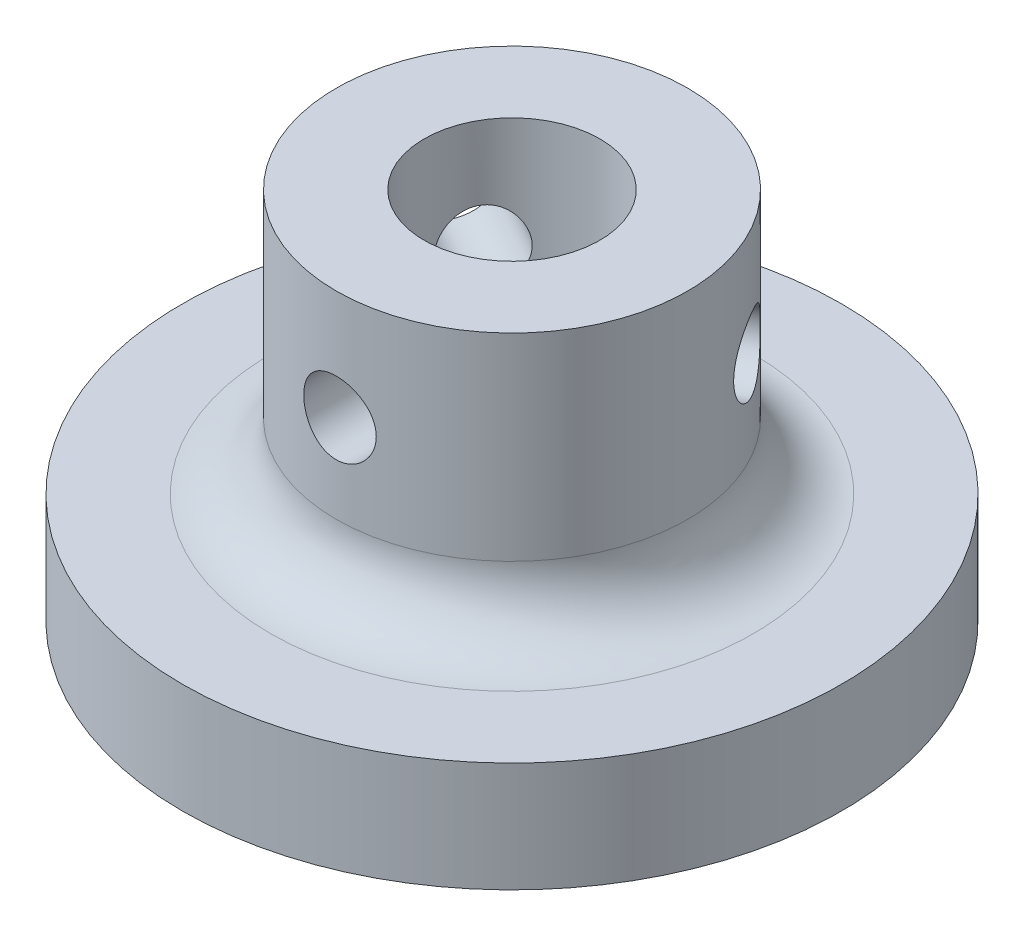
ISO-10303-21;
HEADER;
FILE_DESCRIPTION(('STEP AP214'),'2;1');
FILE_NAME('part.step','',(''),(''),'','','');
FILE_SCHEMA(('AUTOMOTIVE_DESIGN { 1 0 10303 214 1 1 1 1 }'));
ENDSEC;
DATA;
#1=APPLICATION_CONTEXT('core data for automotive mechanical design processes');
#2=APPLICATION_PROTOCOL_DEFINITION('international standard','automotive_design',2000,#1);
#3=PRODUCT_CONTEXT('',#1,'mechanical');
#4=PRODUCT('Part','Part','',(#3));
#5=PRODUCT_RELATED_PRODUCT_CATEGORY('part','',(#4));
#6=PRODUCT_DEFINITION_FORMATION('','',#4);
#7=PRODUCT_DEFINITION_CONTEXT('part definition',#1,'design');
#8=PRODUCT_DEFINITION('design','',#6,#7);
#9=PRODUCT_DEFINITION_SHAPE('','',#8);
#10=(LENGTH_UNIT() NAMED_UNIT(*) SI_UNIT(.MILLI.,.METRE.));
#11=(NAMED_UNIT(*) PLANE_ANGLE_UNIT() SI_UNIT($,.RADIAN.));
#12=(NAMED_UNIT(*) SI_UNIT($,.STERADIAN.) SOLID_ANGLE_UNIT());
#13=UNCERTAINTY_MEASURE_WITH_UNIT(LENGTH_MEASURE(1.E-05),#10,'distance_accuracy_value','');
#14=(GEOMETRIC_REPRESENTATION_CONTEXT(3) GLOBAL_UNCERTAINTY_ASSIGNED_CONTEXT((#13)) GLOBAL_UNIT_ASSIGNED_CONTEXT((#10,
#11,#12)) REPRESENTATION_CONTEXT('',''));
#15=CARTESIAN_POINT('',(0.,0.,0.));
#16=DIRECTION('',(0.,0.,1.));
#17=DIRECTION('',(1.,0.,0.));
#18=AXIS2_PLACEMENT_3D('',#15,#16,#17);
#19=CARTESIAN_POINT('',(0.,0.,0.));
#20=DIRECTION('',(0.,-1.,0.));
#21=DIRECTION('',(0.,0.,-1.));
#22=AXIS2_PLACEMENT_3D('',#19,#20,#21);
#23=PLANE('',#22);
#24=CARTESIAN_POINT('',(0.,0.,0.));
#25=DIRECTION('',(0.,-1.,0.));
#26=DIRECTION('',(0.,0.,-1.));
#27=AXIS2_PLACEMENT_3D('',#24,#25,#26);
#28=CIRCLE('',#27,15.);
#29=CARTESIAN_POINT('',(0.,0.,-15.));
#30=VERTEX_POINT('',#29);
#31=EDGE_CURVE('E44',#30,#30,#28,.T.);
#32=ORIENTED_EDGE('',*,*,#31,.T.);
#33=EDGE_LOOP('',(#32));
#34=FACE_BOUND('',#33,.T.);
#35=ADVANCED_FACE('F33',(#34),#23,.T.);
#36=CARTESIAN_POINT('',(0.,0.,0.));
#37=DIRECTION('',(0.,-1.,0.));
#38=DIRECTION('',(0.,0.,-1.));
#39=AXIS2_PLACEMENT_3D('',#36,#37,#38);
#40=CYLINDRICAL_SURFACE('',#39,15.);
#41=CARTESIAN_POINT('',(0.,5.,0.));
#42=DIRECTION('',(0.,-1.,0.));
#43=DIRECTION('',(0.,0.,-1.));
#44=AXIS2_PLACEMENT_3D('',#41,#42,#43);
#45=CIRCLE('',#44,15.);
#46=CARTESIAN_POINT('',(0.,5.,-15.));
#47=VERTEX_POINT('',#46);
#48=EDGE_CURVE('E48',#47,#47,#45,.T.);
#49=ORIENTED_EDGE('',*,*,#48,.T.);
#50=EDGE_LOOP('',(#49));
#51=FACE_BOUND('',#50,.T.);
#52=ORIENTED_EDGE('',*,*,#31,.F.);
#53=EDGE_LOOP('',(#52));
#54=FACE_BOUND('',#53,.T.);
#55=ADVANCED_FACE('F108',(#51,#54),#40,.T.);
#56=CARTESIAN_POINT('',(15.,5.,0.));
#57=DIRECTION('',(0.,1.,0.));
#58=DIRECTION('',(0.,0.,1.));
#59=AXIS2_PLACEMENT_3D('',#56,#57,#58);
#60=PLANE('',#59);
#61=CARTESIAN_POINT('',(0.,5.,0.));
#62=DIRECTION('',(0.,1.,0.));
#63=DIRECTION('',(0.,0.,1.));
#64=AXIS2_PLACEMENT_3D('',#61,#62,#63);
#65=CIRCLE('',#64,11.);
#66=CARTESIAN_POINT('',(0.,5.,11.));
#67=VERTEX_POINT('',#66);
#68=EDGE_CURVE('E40',#67,#67,#65,.F.);
#69=ORIENTED_EDGE('',*,*,#68,.T.);
#70=EDGE_LOOP('',(#69));
#71=FACE_BOUND('',#70,.T.);
#72=ORIENTED_EDGE('',*,*,#48,.F.);
#73=EDGE_LOOP('',(#72));
#74=FACE_BOUND('',#73,.T.);
#75=ADVANCED_FACE('F104',(#71,#74),#60,.T.);
#76=CARTESIAN_POINT('',(0.,0.,0.));
#77=DIRECTION('',(0.,-1.,0.));
#78=DIRECTION('',(0.,0.,-1.));
#79=AXIS2_PLACEMENT_3D('',#76,#77,#78);
#80=CYLINDRICAL_SURFACE('',#79,8.);
#81=CARTESIAN_POINT('',(5.9542422142892,12.,-5.34293923356578));
#82=CARTESIAN_POINT('',(5.95424546312559,12.0916173497941,-5.34293728182526));
#83=CARTESIAN_POINT('',(5.95947858990529,12.1832758147528,-5.33712137598066));
#84=CARTESIAN_POINT('',(5.98013504615816,12.3639953690858,-5.31396430612541));
#85=CARTESIAN_POINT('',(5.99556627359392,12.4530543894465,-5.29661420934957));
#86=CARTESIAN_POINT('',(6.03577049298905,12.6259344922046,-5.25075207909657));
#87=CARTESIAN_POINT('',(6.0605338828734,12.7097608556128,-5.22225151744077));
#88=CARTESIAN_POINT('',(6.11815110017475,12.8700046022649,-5.15462817183132));
#89=CARTESIAN_POINT('',(6.15100456912211,12.9464223135756,-5.11550585851734));
#90=CARTESIAN_POINT('',(6.22375271533359,13.0908313031456,-5.02675140997717));
#91=CARTESIAN_POINT('',(6.26373640043061,13.1586950012805,-4.97698461579848));
#92=CARTESIAN_POINT('',(6.34865052570452,13.2829546137603,-4.86820182366297));
#93=CARTESIAN_POINT('',(6.39358132420708,13.3393496965757,-4.80918515559486));
#94=CARTESIAN_POINT('',(6.48694344371152,13.4395694263583,-4.68249973445179));
#95=CARTESIAN_POINT('',(6.53540342114925,13.4832723538181,-4.61475565637146));
#96=CARTESIAN_POINT('',(6.63349809589605,13.5560811094342,-4.47260000070962));
#97=CARTESIAN_POINT('',(6.68313267567749,13.5851883915801,-4.39818908813588));
#98=CARTESIAN_POINT('',(6.78102362973295,13.627581112505,-4.2456813819366));
#99=CARTESIAN_POINT('',(6.8292895706517,13.6410821520967,-4.16765069832241));
#100=CARTESIAN_POINT('',(6.92354524236592,13.6525522714217,-4.00911728216338));
#101=CARTESIAN_POINT('',(6.96953520534314,13.6505229387721,-3.92861480313975));
#102=CARTESIAN_POINT('',(7.05725038518751,13.6311524880959,-3.76874109139319));
#103=CARTESIAN_POINT('',(7.09902962840864,13.6140436551209,-3.68937118430128));
#104=CARTESIAN_POINT('',(7.17818123472821,13.5653688535758,-3.53290338614555));
#105=CARTESIAN_POINT('',(7.21555341366428,13.5338022811147,-3.45580559012961));
#106=CARTESIAN_POINT('',(7.28554096291222,13.4568960403091,-3.3057225120769));
#107=CARTESIAN_POINT('',(7.31812310805693,13.411466330109,-3.2327679287501));
#108=CARTESIAN_POINT('',(7.37795494402924,13.3081901859422,-3.09378641711058));
#109=CARTESIAN_POINT('',(7.40520398359253,13.2503422373005,-3.02776033534366));
#110=CARTESIAN_POINT('',(7.45477547917808,13.1226005073049,-2.90359803948272));
#111=CARTESIAN_POINT('',(7.47699731608708,13.0525034239899,-2.84563064886055));
#112=CARTESIAN_POINT('',(7.5159597528074,12.9029229547409,-2.7410712704395));
#113=CARTESIAN_POINT('',(7.53270023535418,12.8234393680477,-2.69447952600923));
#114=CARTESIAN_POINT('',(7.56090301284153,12.657048454677,-2.61430009263019));
#115=CARTESIAN_POINT('',(7.57235258600716,12.5701238244469,-2.58074377736354));
#116=CARTESIAN_POINT('',(7.59007630252242,12.3914888917741,-2.52814555588611));
#117=CARTESIAN_POINT('',(7.59635116730252,12.2997792583274,-2.50910162646341));
#118=CARTESIAN_POINT('',(7.60376655196074,12.1159634354728,-2.48653860379924));
#119=CARTESIAN_POINT('',(7.60499831956625,12.0238947508506,-2.48274362599897));
#120=CARTESIAN_POINT('',(7.60260000069116,11.840422126306,-2.49007784257611));
#121=CARTESIAN_POINT('',(7.59897020860946,11.7490181464683,-2.50120613325308));
#122=CARTESIAN_POINT('',(7.58685010933389,11.5704370742937,-2.53772842089405));
#123=CARTESIAN_POINT('',(7.57841026816282,11.4832261336905,-2.56297424869621));
#124=CARTESIAN_POINT('',(7.55658090288658,11.3144122367372,-2.62663481764988));
#125=CARTESIAN_POINT('',(7.54319094918887,11.2328097678441,-2.66505070173576));
#126=CARTESIAN_POINT('',(7.51108036984432,11.0762885481577,-2.754258778702));
#127=CARTESIAN_POINT('',(7.49228870234175,11.0014776245043,-2.80521451387921));
#128=CARTESIAN_POINT('',(7.44930614833039,10.8617954761987,-2.91743725952026));
#129=CARTESIAN_POINT('',(7.42511466901248,10.7969253441991,-2.97870540193237));
#130=CARTESIAN_POINT('',(7.37083841801758,10.6778790623057,-3.11061091997207));
#131=CARTESIAN_POINT('',(7.34066346750789,10.6238958301419,-3.18138552339865));
#132=CARTESIAN_POINT('',(7.27482701092581,10.5295277172225,-3.32917805266855));
#133=CARTESIAN_POINT('',(7.2391657444407,10.4891422428987,-3.40619570580858));
#134=CARTESIAN_POINT('',(7.16302427036124,10.4233931940816,-3.56351900396697));
#135=CARTESIAN_POINT('',(7.12257425041454,10.397940969232,-3.64380215626953));
#136=CARTESIAN_POINT('',(7.03748156293837,10.3625012475219,-3.80554810837265));
#137=CARTESIAN_POINT('',(6.99283943483998,10.3525117638349,-3.88701075526057));
#138=CARTESIAN_POINT('',(6.90138946606332,10.3483620722436,-4.04711844123866));
#139=CARTESIAN_POINT('',(6.85463695850757,10.3539124875172,-4.12578772606464));
#140=CARTESIAN_POINT('',(6.75964327820806,10.3800433950904,-4.27964942119025));
#141=CARTESIAN_POINT('',(6.71140212668547,10.4006236732284,-4.35484188101518));
#142=CARTESIAN_POINT('',(6.61520415739967,10.4560981411582,-4.49962393926784));
#143=CARTESIAN_POINT('',(6.56724692778823,10.490955510987,-4.56922740324694));
#144=CARTESIAN_POINT('',(6.47324749982679,10.5739570421064,-4.70145245785853));
#145=CARTESIAN_POINT('',(6.427205464753,10.6221023335725,-4.7640734539759));
#146=CARTESIAN_POINT('',(6.33807482085858,10.7312786452856,-4.88204602730884));
#147=CARTESIAN_POINT('',(6.29505003236671,10.79251556975,-4.93725529079));
#148=CARTESIAN_POINT('',(6.2146697719816,10.9257162416465,-5.03805976297003));
#149=CARTESIAN_POINT('',(6.17731565179714,10.9976825385454,-5.08365268044005));
#150=CARTESIAN_POINT('',(6.10961101503578,11.1513011038279,-5.16483177551439));
#151=CARTESIAN_POINT('',(6.0793467240378,11.2330560023084,-5.20029579983412));
#152=CARTESIAN_POINT('',(6.02794495967902,11.4032628861691,-5.25979445427331));
#153=CARTESIAN_POINT('',(6.00679938633934,11.4917088455668,-5.28383922981996));
#154=CARTESIAN_POINT('',(5.97872539300218,11.6502672243023,-5.31555874039535));
#155=CARTESIAN_POINT('',(5.96957200227877,11.719488948401,-5.32581398332239));
#156=CARTESIAN_POINT('',(5.95732928132435,11.8591323765447,-5.33950484819436));
#157=CARTESIAN_POINT('',(5.95423971620976,11.9295540340033,-5.34294073428858));
#158=CARTESIAN_POINT('',(5.9542422142892,12.,-5.34293923356578));
#159=B_SPLINE_CURVE_WITH_KNOTS('',3,(#81,#82,#83,#84,#85,#86,#87,#88,#89,#90,#91,#92,#93,#94,
#95,#96,#97,#98,#99,#100,#101,#102,#103,#104,#105,#106,#107,#108,#109,#110,#111,#112,#113,#114,
#115,#116,#117,#118,#119,#120,#121,#122,#123,#124,#125,#126,#127,#128,#129,#130,#131,#132,#133,
#134,#135,#136,#137,#138,#139,#140,#141,#142,#143,#144,#145,#146,#147,#148,#149,#150,#151,#152,
#153,#154,#155,#156,#157,#158),.UNSPECIFIED.,.T.,.F.,(4,2,2,2,2,2,2,2,2,2,2,2,2,2,2,2,2,2,2,2,2,
2,2,2,2,2,2,2,2,2,2,2,2,2,2,2,2,2,4),(0.,0.27459403698175,0.549400984088786,0.823925944657621,
1.09843874327276,1.3766547467594,1.65489091505464,1.93571338943597,2.21650788327397,
2.49337499570617,2.77021380533169,3.04286128513493,3.31552015429503,3.58998907522695,
3.86449149267071,4.14407920367273,4.42367289560189,4.70393540521657,4.98415883550649,
5.25928898855093,5.53440248143716,5.80668132243981,6.07898379854718,6.35504561674318,
6.6311377568341,6.91175972338564,7.19236943866019,7.47129602001293,7.75018675877315,
8.02391884651822,8.29764703391013,8.57067368982019,8.84372357458458,9.1214337806041,
9.39921008040027,9.68020708192079,9.96095396255218,10.1721016499172,10.38324115827),.UNSPECIFIED.);
#160=CARTESIAN_POINT('',(5.9542422142892,12.,-5.34293923356578));
#161=VERTEX_POINT('',#160);
#162=EDGE_CURVE('E209',#161,#161,#159,.T.);
#163=ORIENTED_EDGE('',*,*,#162,.F.);
#164=EDGE_LOOP('',(#163));
#165=FACE_BOUND('',#164,.T.);
#166=CARTESIAN_POINT('',(-7.60424221428913,12.,-2.48505540107723));
#167=CARTESIAN_POINT('',(-7.60424214845046,12.0916173497941,-2.48505919052234));
#168=CARTESIAN_POINT('',(-7.60182198963287,12.1832758147528,-2.49249916417708));
#169=CARTESIAN_POINT('',(-7.59209560698745,12.3639953690858,-2.52196671497185));
#170=CARTESIAN_POINT('',(-7.58478559613933,12.4530543894465,-2.54400559833072));
#171=CARTESIAN_POINT('',(-7.56516993596613,12.6259344922046,-2.60175453879272));
#172=CARTESIAN_POINT('',(-7.55286942049225,12.7097608556128,-2.63745054434429));
#173=CARTESIAN_POINT('',(-7.52311449395626,12.8700046022649,-2.72116019102735));
#174=CARTESIAN_POINT('',(-7.50566031124521,12.9464223135756,-2.7691732863952));
#175=CARTESIAN_POINT('',(-7.46517077721628,13.0908313031456,-2.87655225336265));
#176=CARTESIAN_POINT('',(-7.44206331174113,13.1586950012805,-2.93606253748293));
#177=CARTESIAN_POINT('',(-7.39031171289414,13.2829546137603,-3.06399172317803));
#178=CARTESIAN_POINT('',(-7.36166717835172,13.3393496965757,-3.13241127012762));
#179=CARTESIAN_POINT('',(-7.29863544510491,13.4395694263583,-3.27660794794115));
#180=CARTESIAN_POINT('',(-7.26419734125025,13.4832723538181,-3.35244755850922));
#181=CARTESIAN_POINT('',(-7.19013426952887,13.5560811094342,-3.50847786664684));
#182=CARTESIAN_POINT('',(-7.15050981881194,13.5851883915801,-3.5886681299306));
#183=CARTESIAN_POINT('',(-7.06737974799821,13.627581112505,-3.74969803604296));
#184=CARTESIAN_POINT('',(-7.02393616417303,13.6410821520968,-3.83051290882325));
#185=CARTESIAN_POINT('',(-6.93377003428769,13.6525522714217,-3.99140742305806));
#186=CARTESIAN_POINT('',(-6.88704782387422,13.6505229387721,-4.07148713882725));
#187=CARTESIAN_POINT('',(-6.79245071802658,13.6311524880959,-4.22738756874327));
#188=CARTESIAN_POINT('',(-6.74460398379953,13.6140436551209,-4.30325440826962));
#189=CARTESIAN_POINT('',(-6.64867469888224,13.5653688535758,-4.45003560917058));
#190=CARTESIAN_POINT('',(-6.60059213842468,13.5338022811147,-4.52094976353196));
#191=CARTESIAN_POINT('',(-6.50561015477684,13.4568960403091,-4.65660229815565));
#192=CARTESIAN_POINT('',(-6.45872070486568,13.411466330109,-4.72129655522415));
#193=CARTESIAN_POINT('',(-6.36827510311564,13.3081901859422,-4.842603200951));
#194=CARTESIAN_POINT('',(-6.32471935877479,13.2503422373005,-4.899214602325));
#195=CARTESIAN_POINT('',(-6.24197740415979,13.1226005073049,-5.00422592473614));
#196=CARTESIAN_POINT('',(-6.20288708974439,13.0525034239899,-5.05245429532918));
#197=CARTESIAN_POINT('',(-6.13181723018801,12.9029229547409,-5.13847644453284));
#198=CARTESIAN_POINT('',(-6.09983783717816,12.8234393680477,-5.1762699999051));
#199=CARTESIAN_POINT('',(-6.04450179975455,12.657048454677,-5.24078403835595));
#200=CARTESIAN_POINT('',(-6.02116596485904,12.5701238244469,-5.26747781721319));
#201=CARTESIAN_POINT('',(-5.98447642712334,12.3914888917741,-5.3091261167036));
#202=CARTESIAN_POINT('',(-5.97112133284545,12.2997792583274,-5.32408227371983));
#203=CARTESIAN_POINT('',(-5.95528887436122,12.1159634354728,-5.34178569654476));
#204=CARTESIAN_POINT('',(-5.95261821098215,12.0238947508506,-5.34474992748283));
#205=CARTESIAN_POINT('',(-5.95777066941726,11.840422126306,-5.33900581412205));
#206=CARTESIAN_POINT('',(-5.96559315580337,11.7490181464683,-5.33029817663036));
#207=CARTESIAN_POINT('',(-5.99116233506698,11.5704370742937,-5.30154071894084));
#208=CARTESIAN_POINT('',(-6.00880594269769,11.4832261336905,-5.28160868818171));
#209=CARTESIAN_POINT('',(-6.05302292999281,11.3144122367372,-5.23087361882717));
#210=CARTESIAN_POINT('',(-6.07959708467117,11.2328097678441,-5.20006963672651));
#211=CARTESIAN_POINT('',(-6.14079825587442,11.0762885481577,-5.12765702080077));
#212=CARTESIAN_POINT('',(-6.17553138325511,11.0014776245043,-5.08590509177546));
#213=CARTESIAN_POINT('',(-6.25122785485701,10.8617954761987,-4.99256973526156));
#214=CARTESIAN_POINT('',(-6.29219188296963,10.7969253441991,-4.94098522841108));
#215=CARTESIAN_POINT('',(-6.37928728699391,10.6778790623057,-4.82802785720747));
#216=CARTESIAN_POINT('',(-6.42549241624926,10.6238958301419,-4.76650828179485));
#217=CARTESIAN_POINT('',(-6.5205662727955,10.5295277172225,-4.63559597326467));
#218=CARTESIAN_POINT('',(-6.56943488371207,10.4891422428987,-4.56620358398741));
#219=CARTESIAN_POINT('',(-6.66761011948466,10.4233931940816,-4.42160148407381));
#220=CARTESIAN_POINT('',(-6.71691235890122,10.397940969232,-4.3464291630651));
#221=CARTESIAN_POINT('',(-6.81444211864373,10.3625012475219,-4.19186375798289));
#222=CARTESIAN_POINT('',(-6.862669776259,10.3525117638349,-4.11247121752672));
#223=CARTESIAN_POINT('',(-6.95560211526884,10.3483620722436,-3.95321937840179));
#224=CARTESIAN_POINT('',(-7.00035546064782,10.3539124875172,-3.8733958767549));
#225=CARTESIAN_POINT('',(-7.08610675714617,10.3800433950904,-3.71419808885374));
#226=CARTESIAN_POINT('',(-7.12710476176631,10.4006236732284,-3.6348237962149));
#227=CARTESIAN_POINT('',(-7.20439071758241,10.4560981411582,-3.47912288189459));
#228=CARTESIAN_POINT('',(-7.24069047077398,10.490955510987,-3.40278897076642));
#229=CARTESIAN_POINT('',(-7.30820101310368,10.5739570421064,-3.25527055090481));
#230=CARTESIAN_POINT('',(-7.33941136901471,10.6221023335725,-3.18408648083028));
#231=CARTESIAN_POINT('',(-7.39701329252365,10.7312786452856,-3.04791079229558));
#232=CARTESIAN_POINT('',(-7.42331352297664,10.79251556975,-2.98304560072859));
#233=CARTESIAN_POINT('',(-7.47042262650706,10.9257162416465,-2.86303201718226));
#234=CARTESIAN_POINT('',(-7.49123019117652,10.9976825385454,-2.8078859414315));
#235=CARTESIAN_POINT('',(-7.52768103138645,11.1513011038279,-2.70866245850498));
#236=CARTESIAN_POINT('',(-7.54326163186878,11.2330560023084,-2.66472080151335));
#237=CARTESIAN_POINT('',(-7.56908809592472,11.4032628861691,-2.59045624055971));
#238=CARTESIAN_POINT('',(-7.57933869570657,11.4917088455668,-2.56012124909663));
#239=CARTESIAN_POINT('',(-7.59277160099189,11.6502672243023,-2.51994870239328));
#240=CARTESIAN_POINT('',(-7.59707620652698,11.719488948401,-2.50689401203252));
#241=CARTESIAN_POINT('',(-7.60281148282867,11.8591323765447,-2.48944607223856));
#242=CARTESIAN_POINT('',(-7.60424226491348,11.9295540340033,-2.48505248731557));
#243=CARTESIAN_POINT('',(-7.60424221428913,12.,-2.48505540107723));
#244=B_SPLINE_CURVE_WITH_KNOTS('',3,(#166,#167,#168,#169,#170,#171,#172,#173,#174,#175,#176,
#177,#178,#179,#180,#181,#182,#183,#184,#185,#186,#187,#188,#189,#190,#191,#192,#193,#194,#195,
#196,#197,#198,#199,#200,#201,#202,#203,#204,#205,#206,#207,#208,#209,#210,#211,#212,#213,#214,
#215,#216,#217,#218,#219,#220,#221,#222,#223,#224,#225,#226,#227,#228,#229,#230,#231,#232,#233,
#234,#235,#236,#237,#238,#239,#240,#241,#242,#243),.UNSPECIFIED.,.T.,.F.,(4,2,2,2,2,2,2,2,2,2,2,
2,2,2,2,2,2,2,2,2,2,2,2,2,2,2,2,2,2,2,2,2,2,2,2,2,2,2,4),(0.,0.27459403698175,0.549400984088786,
0.823925944657621,1.09843874327276,1.3766547467594,1.65489091505464,1.93571338943598,
2.21650788327397,2.49337499570618,2.7702138053317,3.04286128513493,3.31552015429503,
3.58998907522695,3.86449149267072,4.14407920367273,4.4236728956019,4.70393540521657,
4.9841588355065,5.25928898855093,5.53440248143716,5.80668132243981,6.07898379854718,
6.35504561674318,6.6311377568341,6.91175972338565,7.1923694386602,7.47129602001294,
7.75018675877315,8.02391884651822,8.29764703391013,8.57067368982019,8.84372357458458,
9.1214337806041,9.39921008040027,9.68020708192079,9.96095396255218,10.1721016499172,
10.38324115827),.UNSPECIFIED.);
#245=CARTESIAN_POINT('',(-7.60424221428913,12.,-2.48505540107723));
#246=VERTEX_POINT('',#245);
#247=EDGE_CURVE('E219',#246,#246,#244,.T.);
#248=ORIENTED_EDGE('',*,*,#247,.F.);
#249=EDGE_LOOP('',(#248));
#250=FACE_BOUND('',#249,.T.);
#251=CARTESIAN_POINT('',(1.64999999999999,12.,7.82799463464303));
#252=CARTESIAN_POINT('',(1.64999668532493,12.0916173497941,7.82799647234762));
#253=CARTESIAN_POINT('',(1.64234339972764,12.1832758147528,7.82962054015776));
#254=CARTESIAN_POINT('',(1.61196056082935,12.3639953690858,7.83593102109728));
#255=CARTESIAN_POINT('',(1.58921932254547,12.4530543894465,7.84061980768031));
#256=CARTESIAN_POINT('',(1.52939944297714,12.6259344922046,7.85250661788931));
#257=CARTESIAN_POINT('',(1.49233553761891,12.7097608556128,7.85970206178508));
#258=CARTESIAN_POINT('',(1.40496339378156,12.8700046022649,7.8757883628587));
#259=CARTESIAN_POINT('',(1.35465574212316,12.9464223135756,7.88467914491256));
#260=CARTESIAN_POINT('',(1.24141806188275,13.0908313031456,7.90330366333984));
#261=CARTESIAN_POINT('',(1.17832691131059,13.1586950012805,7.91304715328143));
#262=CARTESIAN_POINT('',(1.04166118718968,13.2829546137603,7.93219354684102));
#263=CARTESIAN_POINT('',(0.968085854144699,13.3393496965757,7.9415964257225));
#264=CARTESIAN_POINT('',(0.811692001393453,13.4395694263583,7.95910768239297));
#265=CARTESIAN_POINT('',(0.728793920101062,13.4832723538181,7.9672032148807));
#266=CARTESIAN_POINT('',(0.556636173632877,13.5560811094342,7.98107786735649));
#267=CARTESIAN_POINT('',(0.467377143134515,13.5851883915801,7.9868572180665));
#268=CARTESIAN_POINT('',(0.286356118265318,13.627581112505,7.99537941797959));
#269=CARTESIAN_POINT('',(0.194646593521387,13.6410821520968,7.99816360714569));
#270=CARTESIAN_POINT('',(0.0102247919218243,13.6525522714217,8.00052470522147));
#271=CARTESIAN_POINT('',(-0.0824873814688698,13.6505229387721,8.00010194196704));
#272=CARTESIAN_POINT('',(-0.264799667160886,13.6311524880959,7.9961286601365));
#273=CARTESIAN_POINT('',(-0.354425644609062,13.6140436551209,7.99262559257093));
#274=CARTESIAN_POINT('',(-0.529506535845926,13.5653688535758,7.98293899531616));
#275=CARTESIAN_POINT('',(-0.614961275239552,13.5338022811147,7.97675535366161));
#276=CARTESIAN_POINT('',(-0.779930808135333,13.4568960403091,7.96232481023259));
#277=CARTESIAN_POINT('',(-0.859402403191199,13.411466330109,7.95406448397429));
#278=CARTESIAN_POINT('',(-1.00967984091354,13.3081901859422,7.93638961806161));
#279=CARTESIAN_POINT('',(-1.08048462481769,13.2503422373005,7.92697493766869));
#280=CARTESIAN_POINT('',(-1.21279807501824,13.1226005073049,7.9078239642189));
#281=CARTESIAN_POINT('',(-1.27411022634264,13.0525034239899,7.89808494418976));
#282=CARTESIAN_POINT('',(-1.38414252261934,12.9029229547409,7.87954771497238));
#283=CARTESIAN_POINT('',(-1.43286239817597,12.8234393680477,7.87074952591437));
#284=CARTESIAN_POINT('',(-1.51640121308694,12.657048454677,7.85508413098618));
#285=CARTESIAN_POINT('',(-1.55118662114807,12.5701238244469,7.84822159457677));
#286=CARTESIAN_POINT('',(-1.60559987539904,12.3914888917741,7.83727167258975));
#287=CARTESIAN_POINT('',(-1.62522983445703,12.2997792583274,7.83318390018328));
#288=CARTESIAN_POINT('',(-1.64847767759947,12.1159634354728,7.82832430034404));
#289=CARTESIAN_POINT('',(-1.65238010858406,12.0238947508506,7.82749355348184));
#290=CARTESIAN_POINT('',(-1.64482933127385,11.840422126306,7.8290836566982));
#291=CARTESIAN_POINT('',(-1.63337705280605,11.7490181464683,7.83150430988348));
#292=CARTESIAN_POINT('',(-1.59568777426686,11.5704370742937,7.83926913983493));
#293=CARTESIAN_POINT('',(-1.56960432546508,11.4832261336905,7.84458293687796));
#294=CARTESIAN_POINT('',(-1.50355797289372,11.3144122367372,7.85750843647708));
#295=CARTESIAN_POINT('',(-1.46359386451765,11.2328097678441,7.8651203384623));
#296=CARTESIAN_POINT('',(-1.37028211396986,11.0762885481577,7.88191579950282));
#297=CARTESIAN_POINT('',(-1.31675731908659,11.0014776245043,7.89111960565472));
#298=CARTESIAN_POINT('',(-1.19807829347332,10.8617954761987,7.91000699478186));
#299=CARTESIAN_POINT('',(-1.1329227860428,10.7969253441991,7.91969063034348));
#300=CARTESIAN_POINT('',(-0.991551131023628,10.6778790623057,7.93863877717957));
#301=CARTESIAN_POINT('',(-0.915171051258586,10.6238958301419,7.94789380519354));
#302=CARTESIAN_POINT('',(-0.754260738130265,10.5295277172225,7.96477402593325));
#303=CARTESIAN_POINT('',(-0.669730860728577,10.4891422428987,7.97239928979603));
#304=CARTESIAN_POINT('',(-0.495414150876532,10.4233931940816,7.98512048804082));
#305=CARTESIAN_POINT('',(-0.405661891513268,10.397940969232,7.99023131933467));
#306=CARTESIAN_POINT('',(-0.223039444294584,10.3625012475219,7.99741186635557));
#307=CARTESIAN_POINT('',(-0.13016965858092,10.3525117638349,7.99948197278732));
#308=CARTESIAN_POINT('',(0.0542126492055756,10.3483620722436,8.00033781964049));
#309=CARTESIAN_POINT('',(0.1457185021403,10.3539124875172,7.99918360281958));
#310=CARTESIAN_POINT('',(0.326463478938169,10.3800433950904,7.99384751004402));
#311=CARTESIAN_POINT('',(0.415702635080898,10.4006236732284,7.98966567723011));
#312=CARTESIAN_POINT('',(0.589186560182796,10.4560981411582,7.97874682116246));
#313=CARTESIAN_POINT('',(0.673443542985807,10.490955510987,7.97201637401338));
#314=CARTESIAN_POINT('',(0.834953513276951,10.5739570421064,7.95672300876336));
#315=CARTESIAN_POINT('',(0.912205904261778,10.6221023335725,7.9481599348062));
#316=CARTESIAN_POINT('',(1.05893847166513,10.7312786452856,7.92995681960445));
#317=CARTESIAN_POINT('',(1.12826349060999,10.79251556975,7.92030089151861));
#318=CARTESIAN_POINT('',(1.25575285452552,10.9257162416465,7.90109178015231));
#319=CARTESIAN_POINT('',(1.31391453937944,10.9976825385454,7.89153862187157));
#320=CARTESIAN_POINT('',(1.41807001635073,11.1513011038279,7.8734942340194));
#321=CARTESIAN_POINT('',(1.46391490783103,11.2330560023084,7.86501660134749));
#322=CARTESIAN_POINT('',(1.54114313624576,11.4032628861691,7.85025069483304));
#323=CARTESIAN_POINT('',(1.57253930936729,11.4917088455668,7.84396047891661));
#324=CARTESIAN_POINT('',(1.61404620798977,11.6502672243023,7.83550744278865));
#325=CARTESIAN_POINT('',(1.62750420424828,11.719488948401,7.83270799535493));
#326=CARTESIAN_POINT('',(1.64548220150438,11.8591323765447,7.82895092043294));
#327=CARTESIAN_POINT('',(1.65000254870379,11.9295540340033,7.82799322160417));
#328=CARTESIAN_POINT('',(1.64999999999999,12.,7.82799463464303));
#329=B_SPLINE_CURVE_WITH_KNOTS('',3,(#251,#252,#253,#254,#255,#256,#257,#258,#259,#260,#261,
#262,#263,#264,#265,#266,#267,#268,#269,#270,#271,#272,#273,#274,#275,#276,#277,#278,#279,#280,
#281,#282,#283,#284,#285,#286,#287,#288,#289,#290,#291,#292,#293,#294,#295,#296,#297,#298,#299,
#300,#301,#302,#303,#304,#305,#306,#307,#308,#309,#310,#311,#312,#313,#314,#315,#316,#317,#318,
#319,#320,#321,#322,#323,#324,#325,#326,#327,#328),.UNSPECIFIED.,.T.,.F.,(4,2,2,2,2,2,2,2,2,2,2,
2,2,2,2,2,2,2,2,2,2,2,2,2,2,2,2,2,2,2,2,2,2,2,2,2,2,2,4),(0.,0.27459403698175,0.549400984088786,
0.823925944657621,1.09843874327276,1.3766547467594,1.65489091505464,1.93571338943598,
2.21650788327397,2.49337499570618,2.77021380533169,3.04286128513493,3.31552015429503,
3.58998907522695,3.86449149267072,4.14407920367273,4.4236728956019,4.70393540521657,
4.9841588355065,5.25928898855093,5.53440248143716,5.80668132243981,6.07898379854718,
6.35504561674318,6.6311377568341,6.91175972338565,7.1923694386602,7.47129602001294,
7.75018675877315,8.02391884651822,8.29764703391013,8.57067368982019,8.84372357458459,
9.1214337806041,9.39921008040027,9.68020708192079,9.96095396255218,10.1721016499172,
10.38324115827),.UNSPECIFIED.);
#330=CARTESIAN_POINT('',(1.64999999999999,12.,7.82799463464303));
#331=VERTEX_POINT('',#330);
#332=EDGE_CURVE('E62',#331,#331,#329,.T.);
#333=ORIENTED_EDGE('',*,*,#332,.F.);
#334=EDGE_LOOP('',(#333));
#335=FACE_BOUND('',#334,.T.);
#336=CARTESIAN_POINT('',(0.,8.,0.));
#337=DIRECTION('',(0.,1.,0.));
#338=DIRECTION('',(0.,0.,1.));
#339=AXIS2_PLACEMENT_3D('',#336,#337,#338);
#340=CIRCLE('',#339,8.);
#341=CARTESIAN_POINT('',(0.,8.,8.));
#342=VERTEX_POINT('',#341);
#343=EDGE_CURVE('E10',#342,#342,#340,.T.);
#344=ORIENTED_EDGE('',*,*,#343,.T.);
#345=EDGE_LOOP('',(#344));
#346=FACE_BOUND('',#345,.T.);
#347=CARTESIAN_POINT('',(0.,17.,0.));
#348=DIRECTION('',(0.,-1.,0.));
#349=DIRECTION('',(0.,0.,-1.));
#350=AXIS2_PLACEMENT_3D('',#347,#348,#349);
#351=CIRCLE('',#350,8.);
#352=CARTESIAN_POINT('',(0.,17.,-8.));
#353=VERTEX_POINT('',#352);
#354=EDGE_CURVE('E53',#353,#353,#351,.T.);
#355=ORIENTED_EDGE('',*,*,#354,.T.);
#356=EDGE_LOOP('',(#355));
#357=FACE_BOUND('',#356,.T.);
#358=ADVANCED_FACE('F76',(#165,#250,#335,#346,#357),#80,.T.);
#359=CARTESIAN_POINT('',(8.,17.,0.));
#360=DIRECTION('',(0.,1.,0.));
#361=DIRECTION('',(0.,0.,1.));
#362=AXIS2_PLACEMENT_3D('',#359,#360,#361);
#363=PLANE('',#362);
#364=CARTESIAN_POINT('',(0.,17.,0.));
#365=DIRECTION('',(0.,-1.,0.));
#366=DIRECTION('',(0.,0.,-1.));
#367=AXIS2_PLACEMENT_3D('',#364,#365,#366);
#368=CIRCLE('',#367,4.);
#369=CARTESIAN_POINT('',(0.,17.,-4.));
#370=VERTEX_POINT('',#369);
#371=EDGE_CURVE('E56',#370,#370,#368,.T.);
#372=ORIENTED_EDGE('',*,*,#371,.T.);
#373=EDGE_LOOP('',(#372));
#374=FACE_BOUND('',#373,.T.);
#375=ORIENTED_EDGE('',*,*,#354,.F.);
#376=EDGE_LOOP('',(#375));
#377=FACE_BOUND('',#376,.T.);
#378=ADVANCED_FACE('F97',(#374,#377),#363,.T.);
#379=CARTESIAN_POINT('',(0.,0.,0.));
#380=DIRECTION('',(0.,-1.,0.));
#381=DIRECTION('',(0.,0.,-1.));
#382=AXIS2_PLACEMENT_3D('',#379,#380,#381);
#383=CYLINDRICAL_SURFACE('',#382,4.);
#384=CARTESIAN_POINT('',(2.33064969538766,12.,-3.2508571173445));
#385=CARTESIAN_POINT('',(2.33066224932934,11.9119035197743,-3.25085347438192));
#386=CARTESIAN_POINT('',(2.33700682403456,11.8236595680264,-3.24632890848847));
#387=CARTESIAN_POINT('',(2.36189549077658,11.6497129389211,-3.22826119030092));
#388=CARTESIAN_POINT('',(2.3804730111031,11.5640178994024,-3.21469332464048));
#389=CARTESIAN_POINT('',(2.42826939243315,11.3979970618694,-3.17874053888392));
#390=CARTESIAN_POINT('',(2.45744544098527,11.3176511797814,-3.15639106260528));
#391=CARTESIAN_POINT('',(2.52448174809825,11.1638182331658,-3.1030339505607));
#392=CARTESIAN_POINT('',(2.56233983156412,11.090329457216,-3.07202848294296));
#393=CARTESIAN_POINT('',(2.64691694452834,10.9477713121535,-2.99951597703296));
#394=CARTESIAN_POINT('',(2.69401008894884,10.8791707442198,-2.95752320393307));
#395=CARTESIAN_POINT('',(2.79305965491652,10.7526452280912,-2.86416603747856));
#396=CARTESIAN_POINT('',(2.84501791860424,10.6947243485278,-2.81279808723955));
#397=CARTESIAN_POINT('',(2.95359712608127,10.5888286286981,-2.69865121325668));
#398=CARTESIAN_POINT('',(3.010322349253,10.5413790672938,-2.63548107799867));
#399=CARTESIAN_POINT('',(3.12358794798236,10.4613298546783,-2.50019263454071));
#400=CARTESIAN_POINT('',(3.1801283933711,10.4287237356534,-2.42807824113432));
#401=CARTESIAN_POINT('',(3.28751935870404,10.3809792933438,-2.28037750743388));
#402=CARTESIAN_POINT('',(3.33851299260316,10.3650331520768,-2.20515716183469));
#403=CARTESIAN_POINT('',(3.43585956670216,10.3484533481448,-2.05017789402267));
#404=CARTESIAN_POINT('',(3.48221434250159,10.347813604678,-1.97042078676083));
#405=CARTESIAN_POINT('',(3.56617326722196,10.3614364961366,-1.8137911957903));
#406=CARTESIAN_POINT('',(3.60413451950874,10.3748121837171,-1.73703056259118));
#407=CARTESIAN_POINT('',(3.67391939052599,10.4145688174478,-1.58410347321538));
#408=CARTESIAN_POINT('',(3.70574255704783,10.4409507212907,-1.50793706121286));
#409=CARTESIAN_POINT('',(3.76354638418995,10.5062876617202,-1.35732460057291));
#410=CARTESIAN_POINT('',(3.78943072701566,10.5454279899249,-1.28292239337344));
#411=CARTESIAN_POINT('',(3.83508778243536,10.6349912791866,-1.13920838455075));
#412=CARTESIAN_POINT('',(3.85485834400166,10.6854182005033,-1.06989838105501));
#413=CARTESIAN_POINT('',(3.89015467770641,10.8001882390286,-0.933797121711291));
#414=CARTESIAN_POINT('',(3.90529150226609,10.8652534108987,-0.867512990569922));
#415=CARTESIAN_POINT('',(3.93044134682204,11.0054096663216,-0.745338746825864));
#416=CARTESIAN_POINT('',(3.94045246960276,11.0805044492633,-0.6894524877332));
#417=CARTESIAN_POINT('',(3.95676444636334,11.2415984035473,-0.588815088454713));
#418=CARTESIAN_POINT('',(3.96293777341724,11.3278675716927,-0.544472588858596));
#419=CARTESIAN_POINT('',(3.9722506181849,11.5070466714059,-0.471787809036562));
#420=CARTESIAN_POINT('',(3.97539225577685,11.5999519138738,-0.44343435440697));
#421=CARTESIAN_POINT('',(3.97939863926003,11.783422895185,-0.40586120745952));
#422=CARTESIAN_POINT('',(3.98039614404958,11.8737583011829,-0.39553386769149));
#423=CARTESIAN_POINT('',(3.98081980749349,12.0548056296986,-0.391257445264037));
#424=CARTESIAN_POINT('',(3.98024649202805,12.1455174160593,-0.397302881308579));
#425=CARTESIAN_POINT('',(3.97743610701085,12.3188010090495,-0.424457466121436));
#426=CARTESIAN_POINT('',(3.97530473736295,12.4015281796746,-0.444606296551389));
#427=CARTESIAN_POINT('',(3.96899409123044,12.56263706438,-0.49779283738234));
#428=CARTESIAN_POINT('',(3.96481434230968,12.6410177713517,-0.530833520788966));
#429=CARTESIAN_POINT('',(3.95343989299729,12.7948790056956,-0.609890797822648));
#430=CARTESIAN_POINT('',(3.94612614370803,12.8701001947792,-0.656393307040728));
#431=CARTESIAN_POINT('',(3.92752170581026,13.0124601694297,-0.759823321504297));
#432=CARTESIAN_POINT('',(3.91622931923182,13.0795954877351,-0.816755272753071));
#433=CARTESIAN_POINT('',(3.88760149091287,13.2094296264467,-0.943996931571432));
#434=CARTESIAN_POINT('',(3.86985708239358,13.2713517370487,-1.0150102596165));
#435=CARTESIAN_POINT('',(3.82753366231776,13.3826428556621,-1.16447952527933));
#436=CARTESIAN_POINT('',(3.80295420905809,13.4320110520032,-1.2429359436782));
#437=CARTESIAN_POINT('',(3.74619019485829,13.5167041342068,-1.40478359552679));
#438=CARTESIAN_POINT('',(3.71399196772734,13.5520034750027,-1.4881834924948));
#439=CARTESIAN_POINT('',(3.64190490578614,13.6069916568587,-1.65677774926449));
#440=CARTESIAN_POINT('',(3.60202056360647,13.6266895829389,-1.7419710350219));
#441=CARTESIAN_POINT('',(3.5182526102591,13.6487882289205,-1.90518558505862));
#442=CARTESIAN_POINT('',(3.47483233497904,13.6522848287419,-1.9832973165281));
#443=CARTESIAN_POINT('',(3.38316935850546,13.6448145656297,-2.13590318524712));
#444=CARTESIAN_POINT('',(3.33492747457326,13.6338501500045,-2.2103979324047));
#445=CARTESIAN_POINT('',(3.23708330678705,13.5985553578644,-2.35125554103977));
#446=CARTESIAN_POINT('',(3.18758418438724,13.5746955578854,-2.41780951767856));
#447=CARTESIAN_POINT('',(3.08755003165895,13.51479588512,-2.54431609273214));
#448=CARTESIAN_POINT('',(3.03701480430885,13.4787536752133,-2.60426742154149));
#449=CARTESIAN_POINT('',(2.93458483624174,13.3936954733136,-2.71926613418331));
#450=CARTESIAN_POINT('',(2.88273121959924,13.3441687432271,-2.77397154132293));
#451=CARTESIAN_POINT('',(2.78221130958788,13.23429715321,-2.87478284773346));
#452=CARTESIAN_POINT('',(2.73354617882532,13.1739483769192,-2.92088562145545));
#453=CARTESIAN_POINT('',(2.63858275374186,13.0394124726453,-3.00703543445887));
#454=CARTESIAN_POINT('',(2.59265665086035,12.9645722431151,-3.04647645827997));
#455=CARTESIAN_POINT('',(2.50970533978643,12.8057340243189,-3.1151712234737));
#456=CARTESIAN_POINT('',(2.47268505344032,12.7217310082904,-3.14441933566763));
#457=CARTESIAN_POINT('',(2.41045890044087,12.5472715587301,-3.19237047297409));
#458=CARTESIAN_POINT('',(2.38517739828547,12.4568608919089,-3.21114116946532));
#459=CARTESIAN_POINT('',(2.34834718664343,12.2719528559216,-3.23818010042512));
#460=CARTESIAN_POINT('',(2.33675241720445,12.1774703091231,-3.24648356670118));
#461=CARTESIAN_POINT('',(2.33126223958908,12.0551366863574,-3.25041644366054));
#462=CARTESIAN_POINT('',(2.33064576580877,12.027575567715,-3.25085825764842));
#463=CARTESIAN_POINT('',(2.33064969538766,12.,-3.2508571173445));
#464=B_SPLINE_CURVE_WITH_KNOTS('',3,(#384,#385,#386,#387,#388,#389,#390,#391,#392,#393,#394,
#395,#396,#397,#398,#399,#400,#401,#402,#403,#404,#405,#406,#407,#408,#409,#410,#411,#412,#413,
#414,#415,#416,#417,#418,#419,#420,#421,#422,#423,#424,#425,#426,#427,#428,#429,#430,#431,#432,
#433,#434,#435,#436,#437,#438,#439,#440,#441,#442,#443,#444,#445,#446,#447,#448,#449,#450,#451,
#452,#453,#454,#455,#456,#457,#458,#459,#460,#461,#462,#463),.UNSPECIFIED.,.T.,.F.,(4,2,2,2,2,2,
2,2,2,2,2,2,2,2,2,2,2,2,2,2,2,2,2,2,2,2,2,2,2,2,2,2,2,2,2,2,2,2,2,4),(0.,0.264211724660743,
0.529148459018595,0.793026677872045,1.05683885985755,1.33523297260791,1.61373292676209,
1.90403076094907,2.19420198072698,2.46953816244269,2.74476495901022,3.00356896819764,
3.2623920368679,3.52515526924738,3.78801084539544,4.06907613148063,4.35024537535723,
4.64031806272421,4.93018777241108,5.20152035698261,5.4727621157604,5.72713321026163,
5.98156300028878,6.24665916965706,6.51186861189121,6.79815687284344,7.0844636389886,
7.37128791456167,7.65794504349147,7.92489841526076,8.19180661499931,8.44957452423755,
8.70739191275384,8.97680852354691,9.24632283025302,9.53374725602171,9.82133016535511,
10.1070334851925,10.3917725616093,10.4744749384331),.UNSPECIFIED.);
#465=CARTESIAN_POINT('',(2.33064969538766,12.,-3.2508571173445));
#466=VERTEX_POINT('',#465);
#467=EDGE_CURVE('E204',#466,#466,#464,.T.);
#468=ORIENTED_EDGE('',*,*,#467,.F.);
#469=EDGE_LOOP('',(#468));
#470=FACE_BOUND('',#469,.T.);
#471=CARTESIAN_POINT('',(-3.98064969538762,12.,-0.392973284855906));
#472=CARTESIAN_POINT('',(-3.98065281746032,11.9119035197743,-0.392985978369605));
#473=CARTESIAN_POINT('',(-3.9799067158081,11.8236595680264,-0.400742824187266));
#474=CARTESIAN_POINT('',(-3.97670394624028,11.6497129389211,-0.431330900945959));
#475=CARTESIAN_POINT('',(-3.97424259006646,11.5640178994024,-0.454203438318264));
#476=CARTESIAN_POINT('',(-3.96700475492949,11.3979970618694,-0.51357271163733));
#477=CARTESIAN_POINT('',(-3.96223756498697,11.3176511797814,-0.550014649004836));
#478=CARTESIAN_POINT('',(-3.94954710404028,11.1638182331658,-0.634748349962867));
#479=CARTESIAN_POINT('',(-3.94162462316003,11.090329457216,-0.683037145791767));
#480=CARTESIAN_POINT('',(-3.92111550743202,10.9477713121535,-0.792539327152533));
#481=CARTESIAN_POINT('',(-3.9082952713624,10.8791707442198,-0.854319573114724));
#482=CARTESIAN_POINT('',(-3.87697037657132,10.7526452280912,-0.986777596703809));
#483=CARTESIAN_POINT('',(-3.85846355856785,10.6947243485278,-1.05745874811341));
#484=CARTESIAN_POINT('',(-3.81389906967462,10.5888286286981,-1.20856453710274));
#485=CARTESIAN_POINT('',(-3.78755473936655,10.5413790672938,-1.28927508903379));
#486=CARTESIAN_POINT('',(-3.72702430985819,10.4613298546783,-1.45501019663726));
#487=CARTESIAN_POINT('',(-3.69284163588412,10.4287237356534,-1.54003285538839));
#488=CARTESIAN_POINT('',(-3.61862453100841,10.3809792933438,-1.70688652635387));
#489=CARTESIAN_POINT('',(-3.57897861778762,10.3650331520768,-1.78865848154139));
#490=CARTESIAN_POINT('',(-3.493435921852,10.3484533481448,-1.95045272158852));
#491=CARTESIAN_POINT('',(-3.44754162873061,10.347813604678,-2.03047568864847));
#492=CARTESIAN_POINT('',(-3.35387588632595,10.3614364961366,-2.181501045816));
#493=CARTESIAN_POINT('',(-3.30637985410832,10.3748121837171,-2.25275677125539));
#494=CARTESIAN_POINT('',(-3.20883354529069,10.4145688174478,-2.38965578704405));
#495=CARTESIAN_POINT('',(-3.15878308084232,10.4409507212907,-2.45529866368208));
#496=CARTESIAN_POINT('',(-3.0572507773727,10.5062876617202,-2.58066447674309));
#497=CARTESIAN_POINT('',(-3.00575874725317,10.5454279899249,-2.64028207879017));
#498=CARTESIAN_POINT('',(-2.90412729244287,10.6349912791866,-2.75167925305696));
#499=CARTESIAN_POINT('',(-2.85398834946232,10.6854182005033,-2.80345606336834));
#500=CARTESIAN_POINT('',(-2.75376936823599,10.8001882390286,-2.90207421468896));
#501=CARTESIAN_POINT('',(-2.70393403907962,10.8652534108987,-2.94832515486096));
#502=CARTESIAN_POINT('',(-2.61070296258709,11.0054096663216,-3.03119268101967));
#503=CARTESIAN_POINT('',(-2.56730960388072,11.0805044492633,-3.06780569721451));
#504=CARTESIAN_POINT('',(-2.48831104791505,11.2415984035473,-3.13225098311436));
#505=CARTESIAN_POINT('',(-2.45299598032446,11.3278675716927,-3.15976849096696));
#506=CARTESIAN_POINT('',(-2.39470553691393,11.5070466714059,-3.20417604102827));
#507=CARTESIAN_POINT('',(-2.37172154371563,11.5999519138738,-3.22107350630718));
#508=CARTESIAN_POINT('',(-2.3411854357006,11.783422895185,-3.24332970965464));
#509=CARTESIAN_POINT('',(-2.33274044950275,11.8737583011829,-3.2493572440268));
#510=CARTESIAN_POINT('',(-2.32924879076522,12.0548056296986,-3.25186235854561));
#511=CARTESIAN_POINT('',(-2.33419763422402,12.1455174160593,-3.24834313476589));
#512=CARTESIAN_POINT('',(-2.35630900199258,12.3188010090495,-3.23233197754015));
#513=CARTESIAN_POINT('',(-2.37269271617751,12.4015281796746,-3.22041174206523));
#514=CARTESIAN_POINT('',(-2.41559828861028,12.56263706438,-3.18835329178471));
#515=CARTESIAN_POINT('',(-2.44212248533843,12.6410177713517,-3.16821318133458));
#516=CARTESIAN_POINT('',(-2.50490087094743,12.7948790056956,-3.11883398075915));
#517=CARTESIAN_POINT('',(-2.54151635062538,12.8701001947792,-3.0892488334687));
#518=CARTESIAN_POINT('',(-2.62178715171574,13.0124601694297,-3.02142191039432));
#519=CARTESIAN_POINT('',(-2.66544547449497,13.0795954877351,-2.98317644112365));
#520=CARTESIAN_POINT('',(-2.76132606929187,13.2094296264467,-2.89476318513508));
#521=CARTESIAN_POINT('',(-2.81395321112653,13.2713517370487,-2.84388941255971));
#522=CARTESIAN_POINT('',(-2.92223568223764,13.3826428556621,-2.73250162276759));
#523=CARTESIAN_POINT('',(-2.97789120703116,13.4320110520032,-2.67198698263414));
#524=CARTESIAN_POINT('',(-3.08967337797501,13.5167041342068,-2.54190407839205));
#525=CARTESIAN_POINT('',(-3.14580069385683,13.5520034750027,-2.47231964725582));
#526=CARTESIAN_POINT('',(-3.25576407218093,13.6069916568587,-2.3255932919457));
#527=CARTESIAN_POINT('',(-3.30960145078889,13.6266895829389,-2.24845579552618));
#528=CARTESIAN_POINT('',(-3.40906542071424,13.6487882289205,-2.09430334488597));
#529=CARTESIAN_POINT('',(-3.45500202686037,13.6522848287419,-2.01764441771937));
#530=CARTESIAN_POINT('',(-3.54133109770084,13.6448145656297,-1.86195901714725));
#531=CARTESIAN_POINT('',(-3.58172449922171,13.6338501500045,-1.78293294655676));
#532=CARTESIAN_POINT('',(-3.6547886827229,13.5985553578644,-1.62776860732422));
#533=CARTESIAN_POINT('',(-3.68767655601506,13.5746955578854,-1.55162412154155));
#534=CARTESIAN_POINT('',(-3.74721738739307,13.51479588512,-1.40173871650601));
#535=CARTESIAN_POINT('',(-3.77386914745756,13.4787536752133,-1.32799826143012));
#536=CARTESIAN_POINT('',(-3.82224596997433,13.3936954733136,-1.18179195065427));
#537=CARTESIAN_POINT('',(-3.84369543396036,13.3441687432271,-1.10953269779396));
#538=CARTESIAN_POINT('',(-3.88074063129489,13.23429715321,-0.972074248932727));
#539=CARTESIAN_POINT('',(-3.89633423914179,13.1739483769192,-0.906877622552862));
#540=CARTESIAN_POINT('',(-3.9234604531923,13.0394124726453,-0.781561977498496));
#541=CARTESIAN_POINT('',(-3.93465433033188,12.9645722431151,-0.722068293795735));
#542=CARTESIAN_POINT('',(-3.95267008655969,12.8057340243189,-0.615882968531634));
#543=CARTESIAN_POINT('',(-3.95948955155932,12.7217310082904,-0.569198404003566));
#544=CARTESIAN_POINT('',(-3.96990337810735,12.5472715587301,-0.491333406073033));
#545=CARTESIAN_POINT('',(-3.97351852703777,12.4568608919089,-0.460053634715018));
#546=CARTESIAN_POINT('',(-3.97851982231912,12.2719528559216,-0.414638270326345));
#547=CARTESIAN_POINT('',(-3.97991345033416,12.1774703091231,-0.400445172303144));
#548=CARTESIAN_POINT('',(-3.98057433288324,12.0551366863574,-0.393724100537256));
#549=CARTESIAN_POINT('',(-3.98064871813034,12.027575567715,-0.392969311588806));
#550=CARTESIAN_POINT('',(-3.98064969538762,12.,-0.392973284855906));
#551=B_SPLINE_CURVE_WITH_KNOTS('',3,(#471,#472,#473,#474,#475,#476,#477,#478,#479,#480,#481,
#482,#483,#484,#485,#486,#487,#488,#489,#490,#491,#492,#493,#494,#495,#496,#497,#498,#499,#500,
#501,#502,#503,#504,#505,#506,#507,#508,#509,#510,#511,#512,#513,#514,#515,#516,#517,#518,#519,
#520,#521,#522,#523,#524,#525,#526,#527,#528,#529,#530,#531,#532,#533,#534,#535,#536,#537,#538,
#539,#540,#541,#542,#543,#544,#545,#546,#547,#548,#549,#550),.UNSPECIFIED.,.T.,.F.,(4,2,2,2,2,2,
2,2,2,2,2,2,2,2,2,2,2,2,2,2,2,2,2,2,2,2,2,2,2,2,2,2,2,2,2,2,2,2,2,4),(0.,0.264211724660743,
0.529148459018595,0.793026677872047,1.05683885985756,1.33523297260791,1.61373292676209,
1.90403076094908,2.19420198072698,2.46953816244269,2.74476495901023,3.00356896819765,
3.2623920368679,3.52515526924739,3.78801084539544,4.06907613148063,4.35024537535723,
4.64031806272422,4.93018777241109,5.20152035698261,5.4727621157604,5.72713321026164,
5.98156300028879,6.24665916965706,6.51186861189121,6.79815687284344,7.08446363898861,
7.37128791456168,7.65794504349148,7.92489841526076,8.19180661499932,8.44957452423756,
8.70739191275385,8.97680852354691,9.24632283025303,9.53374725602172,9.82133016535512,
10.1070334851925,10.3917725616093,10.4744749384331),.UNSPECIFIED.);
#552=CARTESIAN_POINT('',(-3.98064969538762,12.,-0.392973284855906));
#553=VERTEX_POINT('',#552);
#554=EDGE_CURVE('E214',#553,#553,#551,.T.);
#555=ORIENTED_EDGE('',*,*,#554,.F.);
#556=EDGE_LOOP('',(#555));
#557=FACE_BOUND('',#556,.T.);
#558=CARTESIAN_POINT('',(1.64999999999999,12.,3.64383040220041));
#559=CARTESIAN_POINT('',(1.64999056813102,11.9119035197743,3.64383945275153));
#560=CARTESIAN_POINT('',(1.64289989177357,11.8236595680264,3.64707173267574));
#561=CARTESIAN_POINT('',(1.61480845546373,11.6497129389211,3.65959209124688));
#562=CARTESIAN_POINT('',(1.59376957896339,11.5640178994024,3.66889676295875));
#563=CARTESIAN_POINT('',(1.53873536249637,11.3979970618694,3.69231325052126));
#564=CARTESIAN_POINT('',(1.50479212400173,11.3176511797814,3.70640571161012));
#565=CARTESIAN_POINT('',(1.42506535594206,11.1638182331658,3.73778230052357));
#566=CARTESIAN_POINT('',(1.37928479159595,11.090329457216,3.75506562873473));
#567=CARTESIAN_POINT('',(1.27419856290371,10.9477713121535,3.7920553041855));
#568=CARTESIAN_POINT('',(1.21428518241359,10.8791707442198,3.81184277704779));
#569=CARTESIAN_POINT('',(1.08391072165482,10.7526452280912,3.85094363418238));
#570=CARTESIAN_POINT('',(1.01344563996364,10.6947243485278,3.87025683535296));
#571=CARTESIAN_POINT('',(0.860301943593379,10.5888286286981,3.90721575035942));
#572=CARTESIAN_POINT('',(0.777232390113588,10.5413790672938,3.92475616703248));
#573=CARTESIAN_POINT('',(0.603436361875854,10.4613298546783,3.95520283117798));
#574=CARTESIAN_POINT('',(0.512713242513041,10.4287237356534,3.96811109652272));
#575=CARTESIAN_POINT('',(0.331105172304395,10.3809792933438,3.98726403378776));
#576=CARTESIAN_POINT('',(0.24046562518449,10.3650331520768,3.99381564337609));
#577=CARTESIAN_POINT('',(0.0575763551498639,10.3484533481448,4.0006306156112));
#578=CARTESIAN_POINT('',(-0.034672713770956,10.347813604678,4.00089647540932));
#579=CARTESIAN_POINT('',(-0.212297380895985,10.3614364961366,3.99529224160632));
#580=CARTESIAN_POINT('',(-0.297754665400396,10.3748121837171,3.98978733384659));
#581=CARTESIAN_POINT('',(-0.465085845235278,10.4145688174478,3.97375926025945));
#582=CARTESIAN_POINT('',(-0.546959476205491,10.4409507212907,3.96323572489496));
#583=CARTESIAN_POINT('',(-0.706295606817228,10.5062876617202,3.93798907731603));
#584=CARTESIAN_POINT('',(-0.783671979762468,10.5454279899249,3.92320447216363));
#585=CARTESIAN_POINT('',(-0.930960489992465,10.6349912791866,3.89088763760773));
#586=CARTESIAN_POINT('',(-1.00086999453932,10.6854182005033,3.87335444442337));
#587=CARTESIAN_POINT('',(-1.1363853094704,10.8001882390286,3.83587133640027));
#588=CARTESIAN_POINT('',(-1.20135746318645,10.8652534108987,3.8158381454309));
#589=CARTESIAN_POINT('',(-1.31973838423493,11.0054096663216,3.77653142784555));
#590=CARTESIAN_POINT('',(-1.37314286572201,11.0805044492633,3.75725818494773));
#591=CARTESIAN_POINT('',(-1.46845339844827,11.2415984035473,3.7210660715691));
#592=CARTESIAN_POINT('',(-1.50994179309276,11.3278675716927,3.70424107982558));
#593=CARTESIAN_POINT('',(-1.57754508127095,11.5070466714059,3.67596385006486));
#594=CARTESIAN_POINT('',(-1.60367071206121,11.5999519138738,3.66450786071418));
#595=CARTESIAN_POINT('',(-1.63821320355941,11.783422895185,3.64919091711419));
#596=CARTESIAN_POINT('',(-1.64765569454681,11.8737583011829,3.64489111171832));
#597=CARTESIAN_POINT('',(-1.65157101672826,12.0548056296986,3.64311980380968));
#598=CARTESIAN_POINT('',(-1.64604885780401,12.1455174160593,3.6456460160745));
#599=CARTESIAN_POINT('',(-1.62112710501826,12.3188010090495,3.65678944366161));
#600=CARTESIAN_POINT('',(-1.60261202118542,12.4015281796746,3.66501803861665));
#601=CARTESIAN_POINT('',(-1.55339580262014,12.56263706438,3.68614612916707));
#602=CARTESIAN_POINT('',(-1.52269185697122,12.6410177713517,3.69904670212357));
#603=CARTESIAN_POINT('',(-1.44853902204984,12.7948790056956,3.72872477858183));
#604=CARTESIAN_POINT('',(-1.40460979308263,12.8701001947792,3.74564214050945));
#605=CARTESIAN_POINT('',(-1.30573455409451,13.0124601694297,3.78124523189864));
#606=CARTESIAN_POINT('',(-1.25078384473683,13.0795954877351,3.79993171387674));
#607=CARTESIAN_POINT('',(-1.12627542162098,13.2094296264467,3.83876011670653));
#608=CARTESIAN_POINT('',(-1.05590387126703,13.2713517370487,3.85889967217623));
#609=CARTESIAN_POINT('',(-0.905297980080099,13.3826428556621,3.89698114804694));
#610=CARTESIAN_POINT('',(-0.8250630020269,13.4320110520032,3.91492292631237));
#611=CARTESIAN_POINT('',(-0.656516816883265,13.5167041342068,3.94668767391886));
#612=CARTESIAN_POINT('',(-0.568191273870489,13.5520034750027,3.96050313975064));
#613=CARTESIAN_POINT('',(-0.386140833605176,13.6069916568587,3.98237104121022));
#614=CARTESIAN_POINT('',(-0.29241911281756,13.6266895829389,3.9904268305481));
#615=CARTESIAN_POINT('',(-0.109187189544836,13.6487882289205,3.9994889299446));
#616=CARTESIAN_POINT('',(-0.0198303081186352,13.6522848287419,4.0009417342475));
#617=CARTESIAN_POINT('',(0.158161739195411,13.6448145656297,3.99786220239439));
#618=CARTESIAN_POINT('',(0.246797024648479,13.6338501500045,3.99333087896147));
#619=CARTESIAN_POINT('',(0.417705375935875,13.5985553578644,3.979024148364));
#620=CARTESIAN_POINT('',(0.50009237162785,13.5746955578854,3.96943363922013));
#621=CARTESIAN_POINT('',(0.659667355734158,13.51479588512,3.94605480923816));
#622=CARTESIAN_POINT('',(0.736854343148741,13.4787536752133,3.93226568297163));
#623=CARTESIAN_POINT('',(0.887661133732616,13.3936954733136,3.90105808483759));
#624=CARTESIAN_POINT('',(0.960964214361147,13.3441687432271,3.8835042391169));
#625=CARTESIAN_POINT('',(1.09852932170704,13.23429715321,3.84685709666619));
#626=CARTESIAN_POINT('',(1.1627880603165,13.1739483769192,3.82776324400832));
#627=CARTESIAN_POINT('',(1.28487769945047,13.0394124726453,3.78859741195738));
#628=CARTESIAN_POINT('',(1.34199767947156,12.9645722431151,3.76854475207572));
#629=CARTESIAN_POINT('',(1.4429647467733,12.8057340243189,3.73105419200534));
#630=CARTESIAN_POINT('',(1.48680449811903,12.7217310082904,3.7136177396712));
#631=CARTESIAN_POINT('',(1.55944447766651,12.5472715587301,3.68370387904713));
#632=CARTESIAN_POINT('',(1.58834112875233,12.4568608919089,3.67119480418034));
#633=CARTESIAN_POINT('',(1.63017263567572,12.2719528559216,3.65281837075147));
#634=CARTESIAN_POINT('',(1.64316103312974,12.1774703091231,3.64692873900432));
#635=CARTESIAN_POINT('',(1.64931209329419,12.0551366863574,3.6441405441978));
#636=CARTESIAN_POINT('',(1.6500029523216,12.027575567715,3.64382756923723));
#637=CARTESIAN_POINT('',(1.64999999999999,12.,3.64383040220041));
#638=B_SPLINE_CURVE_WITH_KNOTS('',3,(#558,#559,#560,#561,#562,#563,#564,#565,#566,#567,#568,
#569,#570,#571,#572,#573,#574,#575,#576,#577,#578,#579,#580,#581,#582,#583,#584,#585,#586,#587,
#588,#589,#590,#591,#592,#593,#594,#595,#596,#597,#598,#599,#600,#601,#602,#603,#604,#605,#606,
#607,#608,#609,#610,#611,#612,#613,#614,#615,#616,#617,#618,#619,#620,#621,#622,#623,#624,#625,
#626,#627,#628,#629,#630,#631,#632,#633,#634,#635,#636,#637),.UNSPECIFIED.,.T.,.F.,(4,2,2,2,2,2,
2,2,2,2,2,2,2,2,2,2,2,2,2,2,2,2,2,2,2,2,2,2,2,2,2,2,2,2,2,2,2,2,2,4),(0.,0.264211724660743,
0.529148459018595,0.793026677872047,1.05683885985756,1.33523297260791,1.61373292676209,
1.90403076094908,2.19420198072698,2.46953816244269,2.74476495901023,3.00356896819765,
3.2623920368679,3.52515526924739,3.78801084539544,4.06907613148063,4.35024537535723,
4.64031806272421,4.93018777241109,5.20152035698261,5.4727621157604,5.72713321026164,
5.98156300028879,6.24665916965706,6.51186861189121,6.79815687284344,7.08446363898861,
7.37128791456168,7.65794504349148,7.92489841526076,8.19180661499932,8.44957452423756,
8.70739191275385,8.97680852354691,9.24632283025303,9.53374725602171,9.82133016535512,
10.1070334851925,10.3917725616093,10.4744749384331),.UNSPECIFIED.);
#639=CARTESIAN_POINT('',(1.64999999999999,12.,3.64383040220041));
#640=VERTEX_POINT('',#639);
#641=EDGE_CURVE('E70',#640,#640,#638,.T.);
#642=ORIENTED_EDGE('',*,*,#641,.F.);
#643=EDGE_LOOP('',(#642));
#644=FACE_BOUND('',#643,.T.);
#645=CARTESIAN_POINT('',(0.,5.,0.));
#646=DIRECTION('',(0.,-1.,0.));
#647=DIRECTION('',(0.,0.,-1.));
#648=AXIS2_PLACEMENT_3D('',#645,#646,#647);
#649=CIRCLE('',#648,4.);
#650=CARTESIAN_POINT('',(0.,5.,-4.));
#651=VERTEX_POINT('',#650);
#652=EDGE_CURVE('E59',#651,#651,#649,.T.);
#653=ORIENTED_EDGE('',*,*,#652,.T.);
#654=EDGE_LOOP('',(#653));
#655=FACE_BOUND('',#654,.T.);
#656=ORIENTED_EDGE('',*,*,#371,.F.);
#657=EDGE_LOOP('',(#656));
#658=FACE_BOUND('',#657,.T.);
#659=ADVANCED_FACE('F94',(#470,#557,#644,#655,#658),#383,.F.);
#660=CARTESIAN_POINT('',(4.,5.,0.));
#661=DIRECTION('',(0.,1.,0.));
#662=DIRECTION('',(0.,0.,1.));
#663=AXIS2_PLACEMENT_3D('',#660,#661,#662);
#664=PLANE('',#663);
#665=ORIENTED_EDGE('',*,*,#652,.F.);
#666=EDGE_LOOP('',(#665));
#667=FACE_BOUND('',#666,.T.);
#668=ADVANCED_FACE('F91',(#667),#664,.T.);
#669=CARTESIAN_POINT('',(0.,8.,0.));
#670=DIRECTION('',(0.,1.,0.));
#671=DIRECTION('',(0.,0.,1.));
#672=AXIS2_PLACEMENT_3D('',#669,#670,#671);
#673=TOROIDAL_SURFACE('',#672,11.,3.);
#674=ORIENTED_EDGE('',*,*,#343,.F.);
#675=EDGE_LOOP('',(#674));
#676=FACE_BOUND('',#675,.T.);
#677=ORIENTED_EDGE('',*,*,#68,.F.);
#678=EDGE_LOOP('',(#677));
#679=FACE_BOUND('',#678,.T.);
#680=ADVANCED_FACE('F35',(#676,#679),#673,.F.);
#681=CARTESIAN_POINT('',(0.,12.,8.));
#682=DIRECTION('',(0.,0.,1.));
#683=DIRECTION('',(1.,0.,0.));
#684=AXIS2_PLACEMENT_3D('',#681,#682,#683);
#685=CYLINDRICAL_SURFACE('',#684,1.64999999999999);
#686=ORIENTED_EDGE('',*,*,#332,.T.);
#687=EDGE_LOOP('',(#686));
#688=FACE_BOUND('',#687,.T.);
#689=ORIENTED_EDGE('',*,*,#641,.T.);
#690=EDGE_LOOP('',(#689));
#691=FACE_BOUND('',#690,.T.);
#692=ADVANCED_FACE('F80',(#688,#691),#685,.F.);
#693=CARTESIAN_POINT('',(-6.92820323027549,12.,-4.00000000000003));
#694=DIRECTION('',(-0.866025403784436,0.,-0.500000000000004));
#695=DIRECTION('',(-0.500000000000004,0.,0.866025403784436));
#696=AXIS2_PLACEMENT_3D('',#693,#694,#695);
#697=CYLINDRICAL_SURFACE('',#696,1.64999999999999);
#698=ORIENTED_EDGE('',*,*,#247,.T.);
#699=EDGE_LOOP('',(#698));
#700=FACE_BOUND('',#699,.T.);
#701=ORIENTED_EDGE('',*,*,#554,.T.);
#702=EDGE_LOOP('',(#701));
#703=FACE_BOUND('',#702,.T.);
#704=ADVANCED_FACE('F84',(#700,#703),#697,.F.);
#705=CARTESIAN_POINT('',(6.92820323027555,12.,-3.99999999999994));
#706=DIRECTION('',(0.866025403784443,0.,-0.499999999999992));
#707=DIRECTION('',(-0.499999999999992,0.,-0.866025403784443));
#708=AXIS2_PLACEMENT_3D('',#705,#706,#707);
#709=CYLINDRICAL_SURFACE('',#708,1.64999999999999);
#710=ORIENTED_EDGE('',*,*,#162,.T.);
#711=EDGE_LOOP('',(#710));
#712=FACE_BOUND('',#711,.T.);
#713=ORIENTED_EDGE('',*,*,#467,.T.);
#714=EDGE_LOOP('',(#713));
#715=FACE_BOUND('',#714,.T.);
#716=ADVANCED_FACE('F152',(#712,#715),#709,.F.);
#717=CLOSED_SHELL('',(#35,#55,#75,#358,#378,#659,#668,#680,#692,#704,#716));
#718=MANIFOLD_SOLID_BREP('B2',#717);
#719=ADVANCED_BREP_SHAPE_REPRESENTATION('',(#18,#718),#14);
#720=SHAPE_DEFINITION_REPRESENTATION(#9,#719);
ENDSEC;
END-ISO-10303-21;
